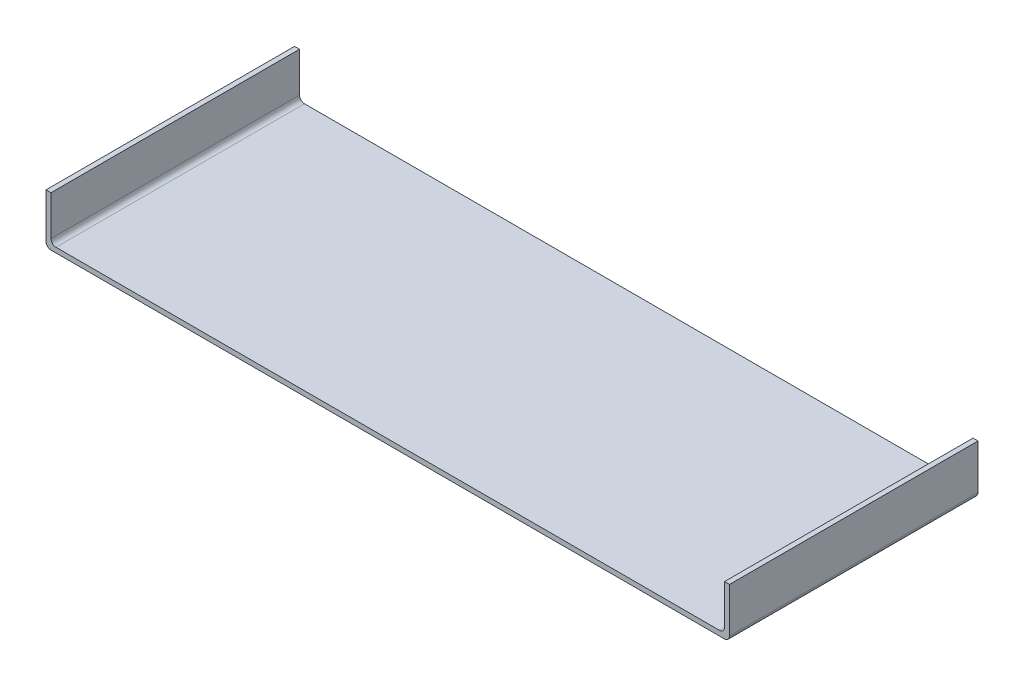
ISO-10303-21;
HEADER;
FILE_DESCRIPTION(('STEP AP214'),'2;1');
FILE_NAME('part.step','',(''),(''),'','','');
FILE_SCHEMA(('AUTOMOTIVE_DESIGN { 1 0 10303 214 1 1 1 1 }'));
ENDSEC;
DATA;
#1=APPLICATION_CONTEXT('core data for automotive mechanical design processes');
#2=APPLICATION_PROTOCOL_DEFINITION('international standard','automotive_design',2000,#1);
#3=PRODUCT_CONTEXT('',#1,'mechanical');
#4=PRODUCT('Part','Part','',(#3));
#5=PRODUCT_RELATED_PRODUCT_CATEGORY('part','',(#4));
#6=PRODUCT_DEFINITION_FORMATION('','',#4);
#7=PRODUCT_DEFINITION_CONTEXT('part definition',#1,'design');
#8=PRODUCT_DEFINITION('design','',#6,#7);
#9=PRODUCT_DEFINITION_SHAPE('','',#8);
#10=(LENGTH_UNIT() NAMED_UNIT(*) SI_UNIT(.MILLI.,.METRE.));
#11=(NAMED_UNIT(*) PLANE_ANGLE_UNIT() SI_UNIT($,.RADIAN.));
#12=(NAMED_UNIT(*) SI_UNIT($,.STERADIAN.) SOLID_ANGLE_UNIT());
#13=UNCERTAINTY_MEASURE_WITH_UNIT(LENGTH_MEASURE(1.E-05),#10,'distance_accuracy_value','');
#14=(GEOMETRIC_REPRESENTATION_CONTEXT(3) GLOBAL_UNCERTAINTY_ASSIGNED_CONTEXT((#13)) GLOBAL_UNIT_ASSIGNED_CONTEXT((#10,
#11,#12)) REPRESENTATION_CONTEXT('',''));
#15=CARTESIAN_POINT('',(0.,0.,0.));
#16=DIRECTION('',(0.,0.,1.));
#17=DIRECTION('',(1.,0.,0.));
#18=AXIS2_PLACEMENT_3D('',#15,#16,#17);
#19=CARTESIAN_POINT('',(0.,20.,0.));
#20=DIRECTION('',(0.,1.,0.));
#21=DIRECTION('',(0.,0.,1.));
#22=AXIS2_PLACEMENT_3D('',#19,#20,#21);
#23=PLANE('',#22);
#24=DIRECTION('',(0.,0.,-1.));
#25=VECTOR('',#24,1.);
#26=CARTESIAN_POINT('',(-2.,20.,0.));
#27=LINE('',#26,#25);
#28=CARTESIAN_POINT('',(-2.,20.,0.));
#29=VERTEX_POINT('',#28);
#30=CARTESIAN_POINT('',(-2.,20.,-100.));
#31=VERTEX_POINT('',#30);
#32=EDGE_CURVE('E138',#29,#31,#27,.T.);
#33=ORIENTED_EDGE('',*,*,#32,.F.);
#34=DIRECTION('',(1.,0.,0.));
#35=VECTOR('',#34,1.);
#36=CARTESIAN_POINT('',(0.,20.,0.));
#37=LINE('',#36,#35);
#38=CARTESIAN_POINT('',(0.,20.,0.));
#39=VERTEX_POINT('',#38);
#40=EDGE_CURVE('E152',#29,#39,#37,.T.);
#41=ORIENTED_EDGE('',*,*,#40,.T.);
#42=DIRECTION('',(0.,0.,-1.));
#43=VECTOR('',#42,1.);
#44=CARTESIAN_POINT('',(0.,20.,0.));
#45=LINE('',#44,#43);
#46=CARTESIAN_POINT('',(0.,20.,-100.));
#47=VERTEX_POINT('',#46);
#48=EDGE_CURVE('E166',#39,#47,#45,.T.);
#49=ORIENTED_EDGE('',*,*,#48,.T.);
#50=DIRECTION('',(-1.,0.,0.));
#51=VECTOR('',#50,1.);
#52=CARTESIAN_POINT('',(0.,20.,-100.));
#53=LINE('',#52,#51);
#54=EDGE_CURVE('E230',#47,#31,#53,.T.);
#55=ORIENTED_EDGE('',*,*,#54,.T.);
#56=EDGE_LOOP('',(#33,#41,#49,#55));
#57=FACE_BOUND('',#56,.T.);
#58=ADVANCED_FACE('F37',(#57),#23,.T.);
#59=CARTESIAN_POINT('',(0.,20.,0.));
#60=DIRECTION('',(-1.,0.,0.));
#61=DIRECTION('',(0.,0.,1.));
#62=AXIS2_PLACEMENT_3D('',#59,#60,#61);
#63=PLANE('',#62);
#64=DIRECTION('',(0.,-1.,0.));
#65=VECTOR('',#64,1.);
#66=CARTESIAN_POINT('',(0.,20.,0.));
#67=LINE('',#66,#65);
#68=CARTESIAN_POINT('',(0.,2.,0.));
#69=VERTEX_POINT('',#68);
#70=EDGE_CURVE('E151',#39,#69,#67,.T.);
#71=ORIENTED_EDGE('',*,*,#70,.T.);
#72=DIRECTION('',(0.,0.,-1.));
#73=VECTOR('',#72,1.);
#74=CARTESIAN_POINT('',(0.,2.,0.));
#75=LINE('',#74,#73);
#76=CARTESIAN_POINT('',(0.,2.,-100.));
#77=VERTEX_POINT('',#76);
#78=EDGE_CURVE('E197',#69,#77,#75,.T.);
#79=ORIENTED_EDGE('',*,*,#78,.T.);
#80=DIRECTION('',(0.,-1.,0.));
#81=VECTOR('',#80,1.);
#82=CARTESIAN_POINT('',(0.,20.,-100.));
#83=LINE('',#82,#81);
#84=EDGE_CURVE('E172',#47,#77,#83,.T.);
#85=ORIENTED_EDGE('',*,*,#84,.F.);
#86=ORIENTED_EDGE('',*,*,#48,.F.);
#87=EDGE_LOOP('',(#71,#79,#85,#86));
#88=FACE_BOUND('',#87,.T.);
#89=ADVANCED_FACE('F257',(#88),#63,.F.);
#90=CARTESIAN_POINT('',(0.,20.,-100.));
#91=DIRECTION('',(0.,0.,1.));
#92=DIRECTION('',(1.,0.,0.));
#93=AXIS2_PLACEMENT_3D('',#90,#91,#92);
#94=PLANE('',#93);
#95=DIRECTION('',(-1.,0.,0.));
#96=VECTOR('',#95,1.);
#97=CARTESIAN_POINT('',(0.,0.,-100.));
#98=LINE('',#97,#96);
#99=CARTESIAN_POINT('',(-2.,0.,-100.));
#100=VERTEX_POINT('',#99);
#101=CARTESIAN_POINT('',(-273.,0.,-100.));
#102=VERTEX_POINT('',#101);
#103=EDGE_CURVE('E160',#100,#102,#98,.T.);
#104=ORIENTED_EDGE('',*,*,#103,.T.);
#105=CARTESIAN_POINT('',(-273.,2.,-100.));
#106=DIRECTION('',(0.,0.,1.));
#107=DIRECTION('',(1.,0.,0.));
#108=AXIS2_PLACEMENT_3D('',#105,#106,#107);
#109=CIRCLE('',#108,2.);
#110=CARTESIAN_POINT('',(-275.,2.,-100.));
#111=VERTEX_POINT('',#110);
#112=EDGE_CURVE('E187',#102,#111,#109,.F.);
#113=ORIENTED_EDGE('',*,*,#112,.T.);
#114=DIRECTION('',(0.,-1.,0.));
#115=VECTOR('',#114,1.);
#116=CARTESIAN_POINT('',(-275.,20.,-100.));
#117=LINE('',#116,#115);
#118=CARTESIAN_POINT('',(-275.,20.,-100.));
#119=VERTEX_POINT('',#118);
#120=EDGE_CURVE('E169',#119,#111,#117,.T.);
#121=ORIENTED_EDGE('',*,*,#120,.F.);
#122=CARTESIAN_POINT('',(-273.,20.,-100.));
#123=VERTEX_POINT('',#122);
#124=EDGE_CURVE('E229',#123,#119,#53,.T.);
#125=ORIENTED_EDGE('',*,*,#124,.F.);
#126=DIRECTION('',(0.,-1.,0.));
#127=VECTOR('',#126,1.);
#128=CARTESIAN_POINT('',(-273.,20.,-100.));
#129=LINE('',#128,#127);
#130=CARTESIAN_POINT('',(-273.,4.,-100.));
#131=VERTEX_POINT('',#130);
#132=EDGE_CURVE('E133',#123,#131,#129,.T.);
#133=ORIENTED_EDGE('',*,*,#132,.T.);
#134=CARTESIAN_POINT('',(-271.,4.,-100.));
#135=DIRECTION('',(0.,0.,1.));
#136=DIRECTION('',(1.,0.,0.));
#137=AXIS2_PLACEMENT_3D('',#134,#135,#136);
#138=CIRCLE('',#137,2.);
#139=CARTESIAN_POINT('',(-271.,2.,-100.));
#140=VERTEX_POINT('',#139);
#141=EDGE_CURVE('E11',#131,#140,#138,.T.);
#142=ORIENTED_EDGE('',*,*,#141,.T.);
#143=DIRECTION('',(-1.,0.,0.));
#144=VECTOR('',#143,1.);
#145=CARTESIAN_POINT('',(0.,2.,-100.));
#146=LINE('',#145,#144);
#147=CARTESIAN_POINT('',(-4.,2.,-100.));
#148=VERTEX_POINT('',#147);
#149=EDGE_CURVE('E215',#148,#140,#146,.T.);
#150=ORIENTED_EDGE('',*,*,#149,.F.);
#151=CARTESIAN_POINT('',(-4.,4.,-100.));
#152=DIRECTION('',(0.,0.,1.));
#153=DIRECTION('',(1.,0.,0.));
#154=AXIS2_PLACEMENT_3D('',#151,#152,#153);
#155=CIRCLE('',#154,2.);
#156=CARTESIAN_POINT('',(-2.,4.,-100.));
#157=VERTEX_POINT('',#156);
#158=EDGE_CURVE('E60',#148,#157,#155,.T.);
#159=ORIENTED_EDGE('',*,*,#158,.T.);
#160=DIRECTION('',(0.,-1.,0.));
#161=VECTOR('',#160,1.);
#162=CARTESIAN_POINT('',(-2.,20.,-100.));
#163=LINE('',#162,#161);
#164=EDGE_CURVE('E164',#31,#157,#163,.T.);
#165=ORIENTED_EDGE('',*,*,#164,.F.);
#166=ORIENTED_EDGE('',*,*,#54,.F.);
#167=ORIENTED_EDGE('',*,*,#84,.T.);
#168=CARTESIAN_POINT('',(-2.,2.,-100.));
#169=DIRECTION('',(0.,0.,1.));
#170=DIRECTION('',(1.,0.,0.));
#171=AXIS2_PLACEMENT_3D('',#168,#169,#170);
#172=CIRCLE('',#171,2.);
#173=EDGE_CURVE('E52',#77,#100,#172,.F.);
#174=ORIENTED_EDGE('',*,*,#173,.T.);
#175=EDGE_LOOP('',(#104,#113,#121,#125,#133,#142,#150,#159,#165,#166,#167,#174));
#176=FACE_BOUND('',#175,.T.);
#177=ADVANCED_FACE('F233',(#176),#94,.F.);
#178=CARTESIAN_POINT('',(-275.,20.,0.));
#179=DIRECTION('',(1.,0.,0.));
#180=DIRECTION('',(0.,0.,-1.));
#181=AXIS2_PLACEMENT_3D('',#178,#179,#180);
#182=PLANE('',#181);
#183=ORIENTED_EDGE('',*,*,#120,.T.);
#184=DIRECTION('',(0.,0.,1.));
#185=VECTOR('',#184,1.);
#186=CARTESIAN_POINT('',(-275.,2.,0.));
#187=LINE('',#186,#185);
#188=CARTESIAN_POINT('',(-275.,2.,0.));
#189=VERTEX_POINT('',#188);
#190=EDGE_CURVE('E175',#111,#189,#187,.T.);
#191=ORIENTED_EDGE('',*,*,#190,.T.);
#192=DIRECTION('',(0.,-1.,0.));
#193=VECTOR('',#192,1.);
#194=CARTESIAN_POINT('',(-275.,20.,0.));
#195=LINE('',#194,#193);
#196=CARTESIAN_POINT('',(-275.,20.,0.));
#197=VERTEX_POINT('',#196);
#198=EDGE_CURVE('E155',#197,#189,#195,.T.);
#199=ORIENTED_EDGE('',*,*,#198,.F.);
#200=DIRECTION('',(0.,0.,1.));
#201=VECTOR('',#200,1.);
#202=CARTESIAN_POINT('',(-275.,20.,0.));
#203=LINE('',#202,#201);
#204=EDGE_CURVE('E149',#119,#197,#203,.T.);
#205=ORIENTED_EDGE('',*,*,#204,.F.);
#206=EDGE_LOOP('',(#183,#191,#199,#205));
#207=FACE_BOUND('',#206,.T.);
#208=ADVANCED_FACE('F237',(#207),#182,.F.);
#209=CARTESIAN_POINT('',(0.,20.,0.));
#210=DIRECTION('',(0.,0.,-1.));
#211=DIRECTION('',(-1.,0.,0.));
#212=AXIS2_PLACEMENT_3D('',#209,#210,#211);
#213=PLANE('',#212);
#214=ORIENTED_EDGE('',*,*,#198,.T.);
#215=CARTESIAN_POINT('',(-273.,2.,0.));
#216=DIRECTION('',(0.,0.,-1.));
#217=DIRECTION('',(-1.,0.,0.));
#218=AXIS2_PLACEMENT_3D('',#215,#216,#217);
#219=CIRCLE('',#218,2.);
#220=CARTESIAN_POINT('',(-273.,0.,0.));
#221=VERTEX_POINT('',#220);
#222=EDGE_CURVE('E180',#189,#221,#219,.F.);
#223=ORIENTED_EDGE('',*,*,#222,.T.);
#224=DIRECTION('',(1.,0.,0.));
#225=VECTOR('',#224,1.);
#226=CARTESIAN_POINT('',(0.,0.,0.));
#227=LINE('',#226,#225);
#228=CARTESIAN_POINT('',(-2.,0.,0.));
#229=VERTEX_POINT('',#228);
#230=EDGE_CURVE('E163',#221,#229,#227,.T.);
#231=ORIENTED_EDGE('',*,*,#230,.T.);
#232=CARTESIAN_POINT('',(-2.,2.,0.));
#233=DIRECTION('',(0.,0.,-1.));
#234=DIRECTION('',(-1.,0.,0.));
#235=AXIS2_PLACEMENT_3D('',#232,#233,#234);
#236=CIRCLE('',#235,2.);
#237=EDGE_CURVE('E178',#229,#69,#236,.F.);
#238=ORIENTED_EDGE('',*,*,#237,.T.);
#239=ORIENTED_EDGE('',*,*,#70,.F.);
#240=ORIENTED_EDGE('',*,*,#40,.F.);
#241=DIRECTION('',(0.,-1.,0.));
#242=VECTOR('',#241,1.);
#243=CARTESIAN_POINT('',(-2.,20.,0.));
#244=LINE('',#243,#242);
#245=CARTESIAN_POINT('',(-2.,4.,0.));
#246=VERTEX_POINT('',#245);
#247=EDGE_CURVE('E137',#29,#246,#244,.T.);
#248=ORIENTED_EDGE('',*,*,#247,.T.);
#249=CARTESIAN_POINT('',(-4.,4.,0.));
#250=DIRECTION('',(0.,0.,-1.));
#251=DIRECTION('',(-1.,0.,0.));
#252=AXIS2_PLACEMENT_3D('',#249,#250,#251);
#253=CIRCLE('',#252,2.);
#254=CARTESIAN_POINT('',(-4.,2.,0.));
#255=VERTEX_POINT('',#254);
#256=EDGE_CURVE('E202',#246,#255,#253,.T.);
#257=ORIENTED_EDGE('',*,*,#256,.T.);
#258=DIRECTION('',(1.,0.,0.));
#259=VECTOR('',#258,1.);
#260=CARTESIAN_POINT('',(0.,2.,0.));
#261=LINE('',#260,#259);
#262=CARTESIAN_POINT('',(-271.,2.,0.));
#263=VERTEX_POINT('',#262);
#264=EDGE_CURVE('E206',#263,#255,#261,.T.);
#265=ORIENTED_EDGE('',*,*,#264,.F.);
#266=CARTESIAN_POINT('',(-271.,4.,0.));
#267=DIRECTION('',(0.,0.,-1.));
#268=DIRECTION('',(-1.,0.,0.));
#269=AXIS2_PLACEMENT_3D('',#266,#267,#268);
#270=CIRCLE('',#269,2.);
#271=CARTESIAN_POINT('',(-273.,4.,0.));
#272=VERTEX_POINT('',#271);
#273=EDGE_CURVE('E45',#263,#272,#270,.T.);
#274=ORIENTED_EDGE('',*,*,#273,.T.);
#275=DIRECTION('',(0.,-1.,0.));
#276=VECTOR('',#275,1.);
#277=CARTESIAN_POINT('',(-273.,20.,0.));
#278=LINE('',#277,#276);
#279=CARTESIAN_POINT('',(-273.,20.,0.));
#280=VERTEX_POINT('',#279);
#281=EDGE_CURVE('E130',#280,#272,#278,.T.);
#282=ORIENTED_EDGE('',*,*,#281,.F.);
#283=EDGE_CURVE('E144',#197,#280,#37,.T.);
#284=ORIENTED_EDGE('',*,*,#283,.F.);
#285=EDGE_LOOP('',(#214,#223,#231,#238,#239,#240,#248,#257,#265,#274,#282,#284));
#286=FACE_BOUND('',#285,.T.);
#287=ADVANCED_FACE('F143',(#286),#213,.F.);
#288=DIRECTION('',(0.,0.,1.));
#289=VECTOR('',#288,1.);
#290=CARTESIAN_POINT('',(-273.,20.,0.));
#291=LINE('',#290,#289);
#292=EDGE_CURVE('E127',#123,#280,#291,.T.);
#293=ORIENTED_EDGE('',*,*,#292,.F.);
#294=ORIENTED_EDGE('',*,*,#124,.T.);
#295=ORIENTED_EDGE('',*,*,#204,.T.);
#296=ORIENTED_EDGE('',*,*,#283,.T.);
#297=EDGE_LOOP('',(#293,#294,#295,#296));
#298=FACE_BOUND('',#297,.T.);
#299=ADVANCED_FACE('F147',(#298),#23,.T.);
#300=CARTESIAN_POINT('',(0.,0.,0.));
#301=DIRECTION('',(0.,1.,0.));
#302=DIRECTION('',(0.,0.,1.));
#303=AXIS2_PLACEMENT_3D('',#300,#301,#302);
#304=PLANE('',#303);
#305=ORIENTED_EDGE('',*,*,#230,.F.);
#306=DIRECTION('',(0.,0.,1.));
#307=VECTOR('',#306,1.);
#308=CARTESIAN_POINT('',(-273.,0.,0.));
#309=LINE('',#308,#307);
#310=EDGE_CURVE('E184',#221,#102,#309,.F.);
#311=ORIENTED_EDGE('',*,*,#310,.T.);
#312=ORIENTED_EDGE('',*,*,#103,.F.);
#313=DIRECTION('',(0.,0.,-1.));
#314=VECTOR('',#313,1.);
#315=CARTESIAN_POINT('',(-2.,0.,0.));
#316=LINE('',#315,#314);
#317=EDGE_CURVE('E182',#100,#229,#316,.F.);
#318=ORIENTED_EDGE('',*,*,#317,.T.);
#319=EDGE_LOOP('',(#305,#311,#312,#318));
#320=FACE_BOUND('',#319,.T.);
#321=ADVANCED_FACE('F243',(#320),#304,.F.);
#322=CARTESIAN_POINT('',(-2.,20.,0.));
#323=DIRECTION('',(-1.,0.,0.));
#324=DIRECTION('',(0.,0.,1.));
#325=AXIS2_PLACEMENT_3D('',#322,#323,#324);
#326=PLANE('',#325);
#327=ORIENTED_EDGE('',*,*,#164,.T.);
#328=DIRECTION('',(0.,0.,-1.));
#329=VECTOR('',#328,1.);
#330=CARTESIAN_POINT('',(-2.,4.,0.));
#331=LINE('',#330,#329);
#332=EDGE_CURVE('E195',#157,#246,#331,.F.);
#333=ORIENTED_EDGE('',*,*,#332,.T.);
#334=ORIENTED_EDGE('',*,*,#247,.F.);
#335=ORIENTED_EDGE('',*,*,#32,.T.);
#336=EDGE_LOOP('',(#327,#333,#334,#335));
#337=FACE_BOUND('',#336,.T.);
#338=ADVANCED_FACE('F219',(#337),#326,.T.);
#339=CARTESIAN_POINT('',(-273.,20.,0.));
#340=DIRECTION('',(1.,0.,0.));
#341=DIRECTION('',(0.,0.,-1.));
#342=AXIS2_PLACEMENT_3D('',#339,#340,#341);
#343=PLANE('',#342);
#344=ORIENTED_EDGE('',*,*,#281,.T.);
#345=DIRECTION('',(0.,0.,1.));
#346=VECTOR('',#345,1.);
#347=CARTESIAN_POINT('',(-273.,4.,-100.));
#348=LINE('',#347,#346);
#349=EDGE_CURVE('E199',#272,#131,#348,.F.);
#350=ORIENTED_EDGE('',*,*,#349,.T.);
#351=ORIENTED_EDGE('',*,*,#132,.F.);
#352=ORIENTED_EDGE('',*,*,#292,.T.);
#353=EDGE_LOOP('',(#344,#350,#351,#352));
#354=FACE_BOUND('',#353,.T.);
#355=ADVANCED_FACE('F129',(#354),#343,.T.);
#356=CARTESIAN_POINT('',(0.,2.,0.));
#357=DIRECTION('',(0.,1.,0.));
#358=DIRECTION('',(0.,0.,1.));
#359=AXIS2_PLACEMENT_3D('',#356,#357,#358);
#360=PLANE('',#359);
#361=ORIENTED_EDGE('',*,*,#264,.T.);
#362=DIRECTION('',(0.,0.,-1.));
#363=VECTOR('',#362,1.);
#364=CARTESIAN_POINT('',(-4.,2.,-100.));
#365=LINE('',#364,#363);
#366=EDGE_CURVE('E192',#255,#148,#365,.T.);
#367=ORIENTED_EDGE('',*,*,#366,.T.);
#368=ORIENTED_EDGE('',*,*,#149,.T.);
#369=DIRECTION('',(0.,0.,1.));
#370=VECTOR('',#369,1.);
#371=CARTESIAN_POINT('',(-271.,2.,0.));
#372=LINE('',#371,#370);
#373=EDGE_CURVE('E189',#140,#263,#372,.T.);
#374=ORIENTED_EDGE('',*,*,#373,.T.);
#375=EDGE_LOOP('',(#361,#367,#368,#374));
#376=FACE_BOUND('',#375,.T.);
#377=ADVANCED_FACE('F212',(#376),#360,.T.);
#378=CARTESIAN_POINT('',(-273.,2.,0.));
#379=DIRECTION('',(0.,0.,1.));
#380=DIRECTION('',(1.,0.,0.));
#381=AXIS2_PLACEMENT_3D('',#378,#379,#380);
#382=CYLINDRICAL_SURFACE('',#381,2.);
#383=ORIENTED_EDGE('',*,*,#112,.F.);
#384=ORIENTED_EDGE('',*,*,#310,.F.);
#385=ORIENTED_EDGE('',*,*,#222,.F.);
#386=ORIENTED_EDGE('',*,*,#190,.F.);
#387=EDGE_LOOP('',(#383,#384,#385,#386));
#388=FACE_BOUND('',#387,.T.);
#389=ADVANCED_FACE('F245',(#388),#382,.T.);
#390=CARTESIAN_POINT('',(-4.,4.,0.));
#391=DIRECTION('',(0.,0.,1.));
#392=DIRECTION('',(1.,0.,0.));
#393=AXIS2_PLACEMENT_3D('',#390,#391,#392);
#394=CYLINDRICAL_SURFACE('',#393,2.);
#395=ORIENTED_EDGE('',*,*,#256,.F.);
#396=ORIENTED_EDGE('',*,*,#332,.F.);
#397=ORIENTED_EDGE('',*,*,#158,.F.);
#398=ORIENTED_EDGE('',*,*,#366,.F.);
#399=EDGE_LOOP('',(#395,#396,#397,#398));
#400=FACE_BOUND('',#399,.T.);
#401=ADVANCED_FACE('F217',(#400),#394,.F.);
#402=CARTESIAN_POINT('',(-2.,2.,0.));
#403=DIRECTION('',(0.,0.,-1.));
#404=DIRECTION('',(-1.,0.,0.));
#405=AXIS2_PLACEMENT_3D('',#402,#403,#404);
#406=CYLINDRICAL_SURFACE('',#405,2.);
#407=ORIENTED_EDGE('',*,*,#237,.F.);
#408=ORIENTED_EDGE('',*,*,#317,.F.);
#409=ORIENTED_EDGE('',*,*,#173,.F.);
#410=ORIENTED_EDGE('',*,*,#78,.F.);
#411=EDGE_LOOP('',(#407,#408,#409,#410));
#412=FACE_BOUND('',#411,.T.);
#413=ADVANCED_FACE('F252',(#412),#406,.T.);
#414=CARTESIAN_POINT('',(-271.,4.,0.));
#415=DIRECTION('',(0.,0.,-1.));
#416=DIRECTION('',(-1.,0.,0.));
#417=AXIS2_PLACEMENT_3D('',#414,#415,#416);
#418=CYLINDRICAL_SURFACE('',#417,2.);
#419=ORIENTED_EDGE('',*,*,#141,.F.);
#420=ORIENTED_EDGE('',*,*,#349,.F.);
#421=ORIENTED_EDGE('',*,*,#273,.F.);
#422=ORIENTED_EDGE('',*,*,#373,.F.);
#423=EDGE_LOOP('',(#419,#420,#421,#422));
#424=FACE_BOUND('',#423,.T.);
#425=ADVANCED_FACE('F39',(#424),#418,.F.);
#426=CLOSED_SHELL('',(#58,#89,#177,#208,#287,#299,#321,#338,#355,#377,#389,#401,#413,#425));
#427=MANIFOLD_SOLID_BREP('B2',#426);
#428=ADVANCED_BREP_SHAPE_REPRESENTATION('',(#18,#427),#14);
#429=SHAPE_DEFINITION_REPRESENTATION(#9,#428);
ENDSEC;
END-ISO-10303-21;
